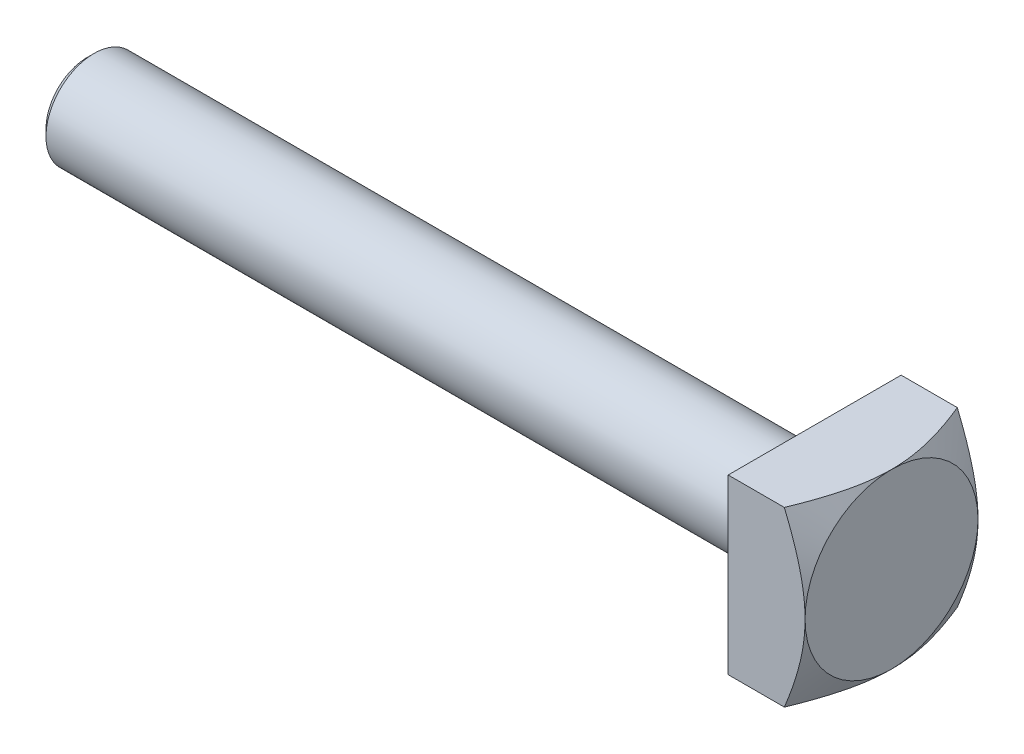
ISO-10303-21;
HEADER;
FILE_DESCRIPTION(('STEP AP214'),'2;1');
FILE_NAME('part.step','',(''),(''),'','','');
FILE_SCHEMA(('AUTOMOTIVE_DESIGN { 1 0 10303 214 1 1 1 1 }'));
ENDSEC;
DATA;
#1=APPLICATION_CONTEXT('core data for automotive mechanical design processes');
#2=APPLICATION_PROTOCOL_DEFINITION('international standard','automotive_design',2000,#1);
#3=PRODUCT_CONTEXT('',#1,'mechanical');
#4=PRODUCT('Part','Part','',(#3));
#5=PRODUCT_RELATED_PRODUCT_CATEGORY('part','',(#4));
#6=PRODUCT_DEFINITION_FORMATION('','',#4);
#7=PRODUCT_DEFINITION_CONTEXT('part definition',#1,'design');
#8=PRODUCT_DEFINITION('design','',#6,#7);
#9=PRODUCT_DEFINITION_SHAPE('','',#8);
#10=(LENGTH_UNIT() NAMED_UNIT(*) SI_UNIT(.MILLI.,.METRE.));
#11=(NAMED_UNIT(*) PLANE_ANGLE_UNIT() SI_UNIT($,.RADIAN.));
#12=(NAMED_UNIT(*) SI_UNIT($,.STERADIAN.) SOLID_ANGLE_UNIT());
#13=UNCERTAINTY_MEASURE_WITH_UNIT(LENGTH_MEASURE(1.E-05),#10,'distance_accuracy_value','');
#14=(GEOMETRIC_REPRESENTATION_CONTEXT(3) GLOBAL_UNCERTAINTY_ASSIGNED_CONTEXT((#13)) GLOBAL_UNIT_ASSIGNED_CONTEXT((#10,
#11,#12)) REPRESENTATION_CONTEXT('',''));
#15=CARTESIAN_POINT('',(0.,0.,0.));
#16=DIRECTION('',(0.,0.,1.));
#17=DIRECTION('',(1.,0.,0.));
#18=AXIS2_PLACEMENT_3D('',#15,#16,#17);
#19=CARTESIAN_POINT('',(49.3325100261348,9.,-9.));
#20=DIRECTION('',(0.,0.,1.));
#21=DIRECTION('',(0.,-1.,0.));
#22=AXIS2_PLACEMENT_3D('',#19,#20,#21);
#23=PLANE('',#22);
#24=CARTESIAN_POINT('',(42.8571264990048,-18.1017748932251,-9.));
#25=CARTESIAN_POINT('',(43.0848290014647,-17.6612589377098,-9.));
#26=CARTESIAN_POINT('',(43.3112860429918,-17.2200930246903,-9.));
#27=CARTESIAN_POINT('',(43.7610460759945,-16.3361243206803,-9.));
#28=CARTESIAN_POINT('',(43.9843488789998,-15.893321433856,-9.));
#29=CARTESIAN_POINT('',(44.4275990724742,-15.0048139056271,-9.));
#30=CARTESIAN_POINT('',(44.6475379613083,-14.5591050150091,-9.));
#31=CARTESIAN_POINT('',(45.0826038939738,-13.6653526957074,-9.));
#32=CARTESIAN_POINT('',(45.2977310422765,-13.2173093179705,-9.));
#33=CARTESIAN_POINT('',(45.7339460114688,-12.2929271397109,-9.));
#34=CARTESIAN_POINT('',(45.9546822234214,-11.8164219208137,-9.));
#35=CARTESIAN_POINT('',(46.3874426773042,-10.8594183684812,-9.));
#36=CARTESIAN_POINT('',(46.5994663826154,-10.3789197912727,-9.));
#37=CARTESIAN_POINT('',(47.0118693140859,-9.41339556488041,-9.));
#38=CARTESIAN_POINT('',(47.2122579538238,-8.92837395459212,-9.));
#39=CARTESIAN_POINT('',(47.5977586152819,-7.95230683121941,-9.));
#40=CARTESIAN_POINT('',(47.782872961797,-7.46126224796708,-9.));
#41=CARTESIAN_POINT('',(48.0440952998417,-6.72205623629925,-9.));
#42=CARTESIAN_POINT('',(48.1279877465829,-6.47664584233824,-9.));
#43=CARTESIAN_POINT('',(48.2899112549478,-5.98390233794157,-9.));
#44=CARTESIAN_POINT('',(48.3679423425386,-5.7365692360293,-9.));
#45=CARTESIAN_POINT('',(48.5919234373371,-4.99146980810668,-9.));
#46=CARTESIAN_POINT('',(48.7277667272913,-4.49058825682384,-9.));
#47=CARTESIAN_POINT('',(48.9615567599171,-3.49029425867013,-9.));
#48=CARTESIAN_POINT('',(49.0602031345005,-2.99105052515099,-9.));
#49=CARTESIAN_POINT('',(49.1761930199103,-2.23731632818205,-9.));
#50=CARTESIAN_POINT('',(49.2095268563288,-1.9852530110465,-9.));
#51=CARTESIAN_POINT('',(49.2646801673453,-1.47988072595095,-9.));
#52=CARTESIAN_POINT('',(49.2865008184612,-1.22657188794033,-9.));
#53=CARTESIAN_POINT('',(49.3215491863488,-0.661621376465719,-9.));
#54=CARTESIAN_POINT('',(49.3317045942102,-0.349782683998991,-9.));
#55=CARTESIAN_POINT('',(49.3332232252704,0.273946712163919,-9.));
#56=CARTESIAN_POINT('',(49.3245857611839,0.585837417345174,-9.));
#57=CARTESIAN_POINT('',(49.2889201862553,1.20861594829024,-9.));
#58=CARTESIAN_POINT('',(49.2618883258218,1.51950355659402,-9.));
#59=CARTESIAN_POINT('',(49.1906150441582,2.13928297825901,-9.));
#60=CARTESIAN_POINT('',(49.1463730476391,2.44817472455294,-9.));
#61=CARTESIAN_POINT('',(49.0409293862979,3.07199163964561,-9.));
#62=CARTESIAN_POINT('',(48.9792843562127,3.38684108287753,-9.));
#63=CARTESIAN_POINT('',(48.8417401677814,4.01338447228308,-9.));
#64=CARTESIAN_POINT('',(48.7658406400166,4.32507833645622,-9.));
#65=CARTESIAN_POINT('',(48.6018632193055,4.94539738591791,-9.));
#66=CARTESIAN_POINT('',(48.5137790599304,5.25402090404895,-9.));
#67=CARTESIAN_POINT('',(48.3740006498793,5.71459738376124,-9.));
#68=CARTESIAN_POINT('',(48.3261331737932,5.86772771850972,-9.));
#69=CARTESIAN_POINT('',(48.228060525201,6.17323857639417,-9.));
#70=CARTESIAN_POINT('',(48.1778553539461,6.32561909993144,-9.));
#71=CARTESIAN_POINT('',(48.0336207759508,6.75327955916404,-9.));
#72=CARTESIAN_POINT('',(47.9371522959459,7.02773820362801,-9.));
#73=CARTESIAN_POINT('',(47.7382764571364,7.5745024899511,-9.));
#74=CARTESIAN_POINT('',(47.635868739271,7.84680800050774,-9.));
#75=CARTESIAN_POINT('',(47.4259979322936,8.38952634357004,-9.));
#76=CARTESIAN_POINT('',(47.3185337697091,8.65993876005014,-9.));
#77=CARTESIAN_POINT('',(47.0993180334821,9.1990230644776,-9.));
#78=CARTESIAN_POINT('',(46.9875663470345,9.46769490641265,-9.));
#79=CARTESIAN_POINT('',(46.6466464450032,10.2718794378225,-9.));
#80=CARTESIAN_POINT('',(46.4120049359439,10.8050727688798,-9.));
#81=CARTESIAN_POINT('',(45.9320394137551,11.8665226777474,-9.));
#82=CARTESIAN_POINT('',(45.6867165417881,12.3947797756403,-9.));
#83=CARTESIAN_POINT('',(45.1872036037991,13.4491484430963,-9.));
#84=CARTESIAN_POINT('',(44.9329876443729,13.9752477145128,-9.));
#85=CARTESIAN_POINT('',(44.4183349749992,15.0244001691293,-9.));
#86=CARTESIAN_POINT('',(44.157898129916,15.5474532858505,-9.));
#87=CARTESIAN_POINT('',(43.6323200467052,16.5908336156542,-9.));
#88=CARTESIAN_POINT('',(43.3671814160637,17.1111621443734,-9.));
#89=CARTESIAN_POINT('',(42.8330653729605,18.149836976446,-9.));
#90=CARTESIAN_POINT('',(42.5640879911795,18.6681832956,-8.99999999999999));
#91=CARTESIAN_POINT('',(41.8255485481526,20.0811503383153,-8.99999999999999));
#92=CARTESIAN_POINT('',(41.3529251789218,20.9741702349986,-8.99999999999999));
#93=CARTESIAN_POINT('',(40.4011346006905,22.7568811836065,-8.99999999999999));
#94=CARTESIAN_POINT('',(39.9219664042756,23.6465717068492,-8.99999999999999));
#95=CARTESIAN_POINT('',(38.9620672069348,25.4174938178518,-8.99999999999999));
#96=CARTESIAN_POINT('',(38.4813675560373,26.2987424115097,-8.99999999999999));
#97=CARTESIAN_POINT('',(37.7577081518417,27.6190826148847,-8.99999999999999));
#98=CARTESIAN_POINT('',(37.5160745934232,28.0589021981923,-8.99999999999999));
#99=CARTESIAN_POINT('',(37.0320269665231,28.938110759695,-8.99999999999999));
#100=CARTESIAN_POINT('',(36.7896128993166,29.3774997385919,-8.99999999999999));
#101=CARTESIAN_POINT('',(36.5468597869242,29.8167013755112,-8.99999999999999));
#102=B_SPLINE_CURVE_WITH_KNOTS('',3,(#24,#25,#26,#27,#28,#29,#30,#31,#32,#33,#34,#35,#36,#37,
#38,#39,#40,#41,#42,#43,#44,#45,#46,#47,#48,#49,#50,#51,#52,#53,#54,#55,#56,#57,#58,#59,#60,#61,
#62,#63,#64,#65,#66,#67,#68,#69,#70,#71,#72,#73,#74,#75,#76,#77,#78,#79,#80,#81,#82,#83,#84,#85,
#86,#87,#88,#89,#90,#91,#92,#93,#94,#95,#96,#97,#98,#99,#100,#101),.UNSPECIFIED.,.F.,.F.,(4,2,2,
2,2,2,2,2,2,2,2,2,2,2,2,2,2,2,2,2,2,2,2,2,2,2,2,2,2,2,2,2,2,2,2,2,2,2,4),(0.,1.48766363582432,
2.97541578887709,4.46645434609266,5.95746049873591,7.53284221712307,9.10832082110335,
10.6825064628679,12.2564520650098,13.0344472240505,13.8124389361993,15.3683742473705,
16.8933806396812,17.6559266959657,18.418394813519,19.3538325720914,20.2893045416898,
21.2249672589862,22.1606612556801,23.1227603009219,24.0848842833078,25.0475049284993,
25.5288024194435,26.0100996527724,26.8827674953854,27.7554881508663,28.6283949265052,
29.5013246841486,31.2487573650983,32.9960038118538,34.7488487487578,36.5017317972244,
38.2536713934606,40.0055969953789,43.0366786505794,46.0682227686008,49.0796961462,
50.5851697239116,52.0906408435993),.UNSPECIFIED.);
#103=CARTESIAN_POINT('',(47.1801932204919,-9.,-9.));
#104=VERTEX_POINT('',#103);
#105=CARTESIAN_POINT('',(49.3325100261348,0.,-9.));
#106=VERTEX_POINT('',#105);
#107=EDGE_CURVE('E214',#104,#106,#102,.T.);
#108=ORIENTED_EDGE('',*,*,#107,.F.);
#109=DIRECTION('',(-1.,0.,0.));
#110=VECTOR('',#109,1.);
#111=CARTESIAN_POINT('',(49.3325100261348,-9.,-9.));
#112=LINE('',#111,#110);
#113=CARTESIAN_POINT('',(41.3325100261348,-9.,-9.));
#114=VERTEX_POINT('',#113);
#115=EDGE_CURVE('E203',#104,#114,#112,.T.);
#116=ORIENTED_EDGE('',*,*,#115,.T.);
#117=DIRECTION('',(0.,1.,0.));
#118=VECTOR('',#117,1.);
#119=CARTESIAN_POINT('',(41.3325100261348,9.,-9.));
#120=LINE('',#119,#118);
#121=CARTESIAN_POINT('',(41.3325100261348,9.,-9.));
#122=VERTEX_POINT('',#121);
#123=EDGE_CURVE('E212',#114,#122,#120,.T.);
#124=ORIENTED_EDGE('',*,*,#123,.T.);
#125=DIRECTION('',(-1.,0.,0.));
#126=VECTOR('',#125,1.);
#127=CARTESIAN_POINT('',(49.3325100261348,9.,-9.));
#128=LINE('',#127,#126);
#129=CARTESIAN_POINT('',(47.180193220492,9.,-8.99999999999999));
#130=VERTEX_POINT('',#129);
#131=EDGE_CURVE('E193',#130,#122,#128,.T.);
#132=ORIENTED_EDGE('',*,*,#131,.F.);
#133=EDGE_CURVE('E98',#106,#130,#102,.T.);
#134=ORIENTED_EDGE('',*,*,#133,.F.);
#135=EDGE_LOOP('',(#108,#116,#124,#132,#134));
#136=FACE_BOUND('',#135,.T.);
#137=ADVANCED_FACE('F42',(#136),#23,.F.);
#138=CARTESIAN_POINT('',(49.3325100261348,9.,9.));
#139=DIRECTION('',(0.,-1.,0.));
#140=DIRECTION('',(1.,0.,0.));
#141=AXIS2_PLACEMENT_3D('',#138,#139,#140);
#142=PLANE('',#141);
#143=CARTESIAN_POINT('',(42.8571265009112,9.,-18.1017748895375));
#144=CARTESIAN_POINT('',(43.0848290032961,9.,-17.6612589341495));
#145=CARTESIAN_POINT('',(43.3112860447483,9.,-17.2200930212575));
#146=CARTESIAN_POINT('',(43.7610460776014,9.,-16.3361243175025));
#147=CARTESIAN_POINT('',(43.984348880532,9.,-15.8933214308058));
#148=CARTESIAN_POINT('',(44.4275990738574,9.,-15.0048139028331));
#149=CARTESIAN_POINT('',(44.6475379626171,9.,-14.5591050123436));
#150=CARTESIAN_POINT('',(45.0826038951346,9.,-13.6653526932995));
#151=CARTESIAN_POINT('',(45.2977310433637,9.,-13.2173093156917));
#152=CARTESIAN_POINT('',(45.7339460124,9.,-12.292927137711));
#153=CARTESIAN_POINT('',(45.9546822242704,9.,-11.8164219189638));
#154=CARTESIAN_POINT('',(46.3874426779917,9.,-10.859418366933));
#155=CARTESIAN_POINT('',(46.5994663832237,9.,-10.378919789876));
#156=CARTESIAN_POINT('',(47.0118693145404,9.,-9.41339556378903));
#157=CARTESIAN_POINT('',(47.2122579542037,9.,-8.92837395365442));
#158=CARTESIAN_POINT('',(47.59775861552,9.,-7.95230683059232));
#159=CARTESIAN_POINT('',(47.7828729619681,9.,-7.46126224749691));
#160=CARTESIAN_POINT('',(48.0440952999135,9.,-6.72205623608937));
#161=CARTESIAN_POINT('',(48.1279877466184,9.,-6.47664584223019));
#162=CARTESIAN_POINT('',(48.2899112549158,9.,-5.98390233803879));
#163=CARTESIAN_POINT('',(48.3679423424753,9.,-5.73656923622994));
#164=CARTESIAN_POINT('',(48.5919234371887,9.,-4.99146980862027));
#165=CARTESIAN_POINT('',(48.7277667270982,9.,-4.49058825754963));
#166=CARTESIAN_POINT('',(48.9615567596714,9.,-3.49029425981931));
#167=CARTESIAN_POINT('',(49.0602031342458,9.,-2.99105052651115));
#168=CARTESIAN_POINT('',(49.1761930196747,9.,-2.23731632986047));
#169=CARTESIAN_POINT('',(49.209526856105,9.,-1.98525301283123));
#170=CARTESIAN_POINT('',(49.2646801671563,9.,-1.47988072794818));
#171=CARTESIAN_POINT('',(49.2865008182954,9.,-1.22657189004375));
#172=CARTESIAN_POINT('',(49.3215491862619,9.,-0.661621378563955));
#173=CARTESIAN_POINT('',(49.3317045941679,9.,-0.349782685984671));
#174=CARTESIAN_POINT('',(49.3332232253036,9.,0.273946710405681));
#175=CARTESIAN_POINT('',(49.324585761248,9.,0.585837415701822));
#176=CARTESIAN_POINT('',(49.2889201863663,9.,1.20861594687753));
#177=CARTESIAN_POINT('',(49.2618883259489,9.,1.51950355529706));
#178=CARTESIAN_POINT('',(49.1906150443029,9.,2.1392829771931));
#179=CARTESIAN_POINT('',(49.1463730477854,9.,2.44817472360233));
#180=CARTESIAN_POINT('',(49.0409293864338,9.,3.07199163892937));
#181=CARTESIAN_POINT('',(48.9792843563362,9.,3.38684108228029));
#182=CARTESIAN_POINT('',(48.8417401678683,9.,4.01338447192159));
#183=CARTESIAN_POINT('',(48.7658406400794,9.,4.32507833621148));
#184=CARTESIAN_POINT('',(48.6018632193108,9.,4.94539738590476));
#185=CARTESIAN_POINT('',(48.5137790599021,9.,5.25402090415064));
#186=CARTESIAN_POINT('',(48.3740006497954,9.,5.71459738403346));
#187=CARTESIAN_POINT('',(48.3261331736899,9.,5.86772771883849));
#188=CARTESIAN_POINT('',(48.2280605250571,9.,6.17323857683552));
#189=CARTESIAN_POINT('',(48.1778553537812,9.,6.32561910042881));
#190=CARTESIAN_POINT('',(48.0336207757631,9.,6.7532795597048));
#191=CARTESIAN_POINT('',(47.9371522957579,9.,7.02773820415654));
#192=CARTESIAN_POINT('',(47.7382764569487,9.,7.57450249045549));
#193=CARTESIAN_POINT('',(47.635868739084,9.,7.8468080010002));
#194=CARTESIAN_POINT('',(47.4259979321088,9.,8.38952634403891));
#195=CARTESIAN_POINT('',(47.3185337695259,9.,8.65993876050735));
#196=CARTESIAN_POINT('',(47.0993180333028,9.,9.19902306491171));
#197=CARTESIAN_POINT('',(46.9875663468575,9.,9.46769490683534));
#198=CARTESIAN_POINT('',(46.6466464448341,9.,10.2718794382111));
#199=CARTESIAN_POINT('',(46.4120049357812,9.,10.805072769246));
#200=CARTESIAN_POINT('',(45.9320394136067,9.,11.8665226780694));
#201=CARTESIAN_POINT('',(45.6867165416476,9.,12.3947797759406));
#202=CARTESIAN_POINT('',(45.187203603676,9.,13.4491484433524));
#203=CARTESIAN_POINT('',(44.9329876442593,9.,13.9752477147464));
#204=CARTESIAN_POINT('',(44.4183349749054,9.,15.0244001693183));
#205=CARTESIAN_POINT('',(44.1578981298326,9.,15.5474532860173));
#206=CARTESIAN_POINT('',(43.6323200466427,9.,16.5908336157771));
#207=CARTESIAN_POINT('',(43.3671814160119,9.,17.1111621444745));
#208=CARTESIAN_POINT('',(42.8330653729305,9.,18.1498369765037));
#209=CARTESIAN_POINT('',(42.5640879911607,9.,18.6681832956361));
#210=CARTESIAN_POINT('',(41.825548548165,9.,20.0811503382915));
#211=CARTESIAN_POINT('',(41.3529251789544,9.,20.9741702349368));
#212=CARTESIAN_POINT('',(40.4011346007645,9.,22.7568811834687));
#213=CARTESIAN_POINT('',(39.9219664043703,9.,23.6465717066735));
#214=CARTESIAN_POINT('',(38.9620672070701,9.,25.4174938176032));
#215=CARTESIAN_POINT('',(38.4813675561922,9.,26.298742411226));
#216=CARTESIAN_POINT('',(37.7577081520262,9.,27.6190826145486));
#217=CARTESIAN_POINT('',(37.5160745936175,9.,28.0589021978388));
#218=CARTESIAN_POINT('',(37.0320269667372,9.,28.9381107593066));
#219=CARTESIAN_POINT('',(36.7896128995406,9.,29.3774997381861));
#220=CARTESIAN_POINT('',(36.5468597871582,9.,29.8167013750879));
#221=B_SPLINE_CURVE_WITH_KNOTS('',3,(#143,#144,#145,#146,#147,#148,#149,#150,#151,#152,#153,
#154,#155,#156,#157,#158,#159,#160,#161,#162,#163,#164,#165,#166,#167,#168,#169,#170,#171,#172,
#173,#174,#175,#176,#177,#178,#179,#180,#181,#182,#183,#184,#185,#186,#187,#188,#189,#190,#191,
#192,#193,#194,#195,#196,#197,#198,#199,#200,#201,#202,#203,#204,#205,#206,#207,#208,#209,#210,
#211,#212,#213,#214,#215,#216,#217,#218,#219,#220),.UNSPECIFIED.,.F.,.F.,(4,2,2,2,2,2,2,2,2,2,2,
2,2,2,2,2,2,2,2,2,2,2,2,2,2,2,2,2,2,2,2,2,2,2,2,2,2,2,4),(0.,1.48766363538162,2.97541578799165,
4.46645434476266,5.95746049696137,7.53284221483657,9.10832081830478,10.6825064595578,
12.2564520611885,13.0344472199051,13.8124389317298,15.3683742422529,16.8933806339401,
17.6559266899135,18.4183948071557,19.3538325660694,20.2893045360091,21.2249672536466,
22.1606612506816,23.1227602962805,24.0848842790234,25.0475049245735,25.5288024156972,
26.0100996492054,26.8827674917841,27.7554881472308,28.6283949228355,29.5013246804446,
31.2487573613252,32.9960038080116,34.7488487448424,36.5017317932358,38.2536713893991,
40.0055969912446,43.0366786463155,46.0682227642071,49.0796961416859,50.5851697193374,
52.0906408389649),.UNSPECIFIED.);
#222=CARTESIAN_POINT('',(49.3325100261348,9.,0.));
#223=VERTEX_POINT('',#222);
#224=EDGE_CURVE('E94',#130,#223,#221,.T.);
#225=ORIENTED_EDGE('',*,*,#224,.F.);
#226=ORIENTED_EDGE('',*,*,#131,.T.);
#227=DIRECTION('',(0.,0.,1.));
#228=VECTOR('',#227,1.);
#229=CARTESIAN_POINT('',(41.3325100261348,9.,9.));
#230=LINE('',#229,#228);
#231=CARTESIAN_POINT('',(41.3325100261348,9.,9.));
#232=VERTEX_POINT('',#231);
#233=EDGE_CURVE('E211',#122,#232,#230,.T.);
#234=ORIENTED_EDGE('',*,*,#233,.T.);
#235=DIRECTION('',(-1.,0.,0.));
#236=VECTOR('',#235,1.);
#237=CARTESIAN_POINT('',(49.3325100261348,9.,9.));
#238=LINE('',#237,#236);
#239=CARTESIAN_POINT('',(47.1801932204919,9.,9.));
#240=VERTEX_POINT('',#239);
#241=EDGE_CURVE('E115',#240,#232,#238,.T.);
#242=ORIENTED_EDGE('',*,*,#241,.F.);
#243=EDGE_CURVE('E102',#223,#240,#221,.T.);
#244=ORIENTED_EDGE('',*,*,#243,.F.);
#245=EDGE_LOOP('',(#225,#226,#234,#242,#244));
#246=FACE_BOUND('',#245,.T.);
#247=ADVANCED_FACE('F113',(#246),#142,.F.);
#248=CARTESIAN_POINT('',(49.3325100261348,9.,9.));
#249=DIRECTION('',(0.,0.,-1.));
#250=DIRECTION('',(-1.,0.,0.));
#251=AXIS2_PLACEMENT_3D('',#248,#249,#250);
#252=PLANE('',#251);
#253=CARTESIAN_POINT('',(42.8571265009112,-18.1017748895375,9.));
#254=CARTESIAN_POINT('',(43.0848290032961,-17.6612589341495,9.));
#255=CARTESIAN_POINT('',(43.3112860447482,-17.2200930212575,9.));
#256=CARTESIAN_POINT('',(43.7610460776014,-16.3361243175025,9.));
#257=CARTESIAN_POINT('',(43.984348880532,-15.8933214308058,9.));
#258=CARTESIAN_POINT('',(44.4275990738574,-15.0048139028331,9.));
#259=CARTESIAN_POINT('',(44.6475379626171,-14.5591050123436,9.));
#260=CARTESIAN_POINT('',(45.0826038951346,-13.6653526932995,9.));
#261=CARTESIAN_POINT('',(45.2977310433637,-13.2173093156917,9.));
#262=CARTESIAN_POINT('',(45.7339460124,-12.292927137711,9.));
#263=CARTESIAN_POINT('',(45.9546822242704,-11.8164219189638,9.));
#264=CARTESIAN_POINT('',(46.3874426779917,-10.859418366933,9.));
#265=CARTESIAN_POINT('',(46.5994663832237,-10.378919789876,9.));
#266=CARTESIAN_POINT('',(47.0118693145404,-9.41339556378903,9.));
#267=CARTESIAN_POINT('',(47.2122579542037,-8.92837395365442,9.));
#268=CARTESIAN_POINT('',(47.59775861552,-7.95230683059232,9.));
#269=CARTESIAN_POINT('',(47.7828729619681,-7.46126224749691,9.));
#270=CARTESIAN_POINT('',(48.0440952999135,-6.72205623608937,9.));
#271=CARTESIAN_POINT('',(48.1279877466184,-6.47664584223019,9.));
#272=CARTESIAN_POINT('',(48.2899112549158,-5.98390233803879,9.));
#273=CARTESIAN_POINT('',(48.3679423424753,-5.73656923622994,9.));
#274=CARTESIAN_POINT('',(48.5919234371887,-4.99146980862027,9.));
#275=CARTESIAN_POINT('',(48.7277667270982,-4.49058825754963,9.));
#276=CARTESIAN_POINT('',(48.9615567596714,-3.49029425981931,9.));
#277=CARTESIAN_POINT('',(49.0602031342458,-2.99105052651115,9.));
#278=CARTESIAN_POINT('',(49.1761930196747,-2.23731632986048,9.));
#279=CARTESIAN_POINT('',(49.209526856105,-1.98525301283123,9.));
#280=CARTESIAN_POINT('',(49.2646801671563,-1.47988072794818,9.));
#281=CARTESIAN_POINT('',(49.2865008182954,-1.22657189004375,9.));
#282=CARTESIAN_POINT('',(49.3215491862619,-0.661621378563957,9.));
#283=CARTESIAN_POINT('',(49.3317045941679,-0.349782685984673,9.));
#284=CARTESIAN_POINT('',(49.3332232253036,0.27394671040568,9.));
#285=CARTESIAN_POINT('',(49.324585761248,0.585837415701821,9.));
#286=CARTESIAN_POINT('',(49.2889201863663,1.20861594687753,9.));
#287=CARTESIAN_POINT('',(49.2618883259489,1.51950355529706,9.));
#288=CARTESIAN_POINT('',(49.1906150443029,2.1392829771931,9.));
#289=CARTESIAN_POINT('',(49.1463730477854,2.44817472360233,9.));
#290=CARTESIAN_POINT('',(49.0409293864338,3.07199163892937,9.));
#291=CARTESIAN_POINT('',(48.9792843563362,3.38684108228029,9.));
#292=CARTESIAN_POINT('',(48.8417401678683,4.01338447192159,9.));
#293=CARTESIAN_POINT('',(48.7658406400794,4.32507833621148,9.));
#294=CARTESIAN_POINT('',(48.6018632193108,4.94539738590476,9.));
#295=CARTESIAN_POINT('',(48.5137790599021,5.25402090415063,9.));
#296=CARTESIAN_POINT('',(48.3740006497954,5.71459738403345,9.));
#297=CARTESIAN_POINT('',(48.3261331736899,5.86772771883849,9.));
#298=CARTESIAN_POINT('',(48.2280605250571,6.17323857683551,9.));
#299=CARTESIAN_POINT('',(48.1778553537812,6.32561910042881,9.));
#300=CARTESIAN_POINT('',(48.0336207757631,6.75327955970481,9.));
#301=CARTESIAN_POINT('',(47.9371522957579,7.02773820415655,9.));
#302=CARTESIAN_POINT('',(47.7382764569487,7.57450249045549,9.));
#303=CARTESIAN_POINT('',(47.6358687390839,7.8468080010002,9.));
#304=CARTESIAN_POINT('',(47.4259979321088,8.38952634403891,9.));
#305=CARTESIAN_POINT('',(47.3185337695259,8.65993876050735,9.));
#306=CARTESIAN_POINT('',(47.0993180333028,9.19902306491171,9.));
#307=CARTESIAN_POINT('',(46.9875663468575,9.46769490683534,9.));
#308=CARTESIAN_POINT('',(46.6466464448341,10.2718794382111,9.));
#309=CARTESIAN_POINT('',(46.4120049357812,10.805072769246,9.));
#310=CARTESIAN_POINT('',(45.9320394136067,11.8665226780694,9.));
#311=CARTESIAN_POINT('',(45.6867165416476,12.3947797759406,9.));
#312=CARTESIAN_POINT('',(45.187203603676,13.4491484433524,9.));
#313=CARTESIAN_POINT('',(44.9329876442593,13.9752477147464,9.));
#314=CARTESIAN_POINT('',(44.4183349749054,15.0244001693183,9.));
#315=CARTESIAN_POINT('',(44.1578981298326,15.5474532860173,9.));
#316=CARTESIAN_POINT('',(43.6323200466427,16.5908336157771,9.));
#317=CARTESIAN_POINT('',(43.3671814160119,17.1111621444745,9.));
#318=CARTESIAN_POINT('',(42.8330653729305,18.1498369765037,9.));
#319=CARTESIAN_POINT('',(42.5640879911607,18.6681832956361,9.));
#320=CARTESIAN_POINT('',(41.825548548165,20.0811503382915,9.));
#321=CARTESIAN_POINT('',(41.3529251789544,20.9741702349368,9.));
#322=CARTESIAN_POINT('',(40.4011346007645,22.7568811834687,9.));
#323=CARTESIAN_POINT('',(39.9219664043703,23.6465717066735,9.));
#324=CARTESIAN_POINT('',(38.9620672070701,25.4174938176032,9.));
#325=CARTESIAN_POINT('',(38.4813675561922,26.298742411226,9.));
#326=CARTESIAN_POINT('',(37.7577081520262,27.6190826145486,9.));
#327=CARTESIAN_POINT('',(37.5160745936175,28.0589021978388,9.));
#328=CARTESIAN_POINT('',(37.0320269667372,28.9381107593066,9.));
#329=CARTESIAN_POINT('',(36.7896128995406,29.3774997381861,9.));
#330=CARTESIAN_POINT('',(36.5468597871582,29.8167013750879,9.));
#331=B_SPLINE_CURVE_WITH_KNOTS('',3,(#253,#254,#255,#256,#257,#258,#259,#260,#261,#262,#263,
#264,#265,#266,#267,#268,#269,#270,#271,#272,#273,#274,#275,#276,#277,#278,#279,#280,#281,#282,
#283,#284,#285,#286,#287,#288,#289,#290,#291,#292,#293,#294,#295,#296,#297,#298,#299,#300,#301,
#302,#303,#304,#305,#306,#307,#308,#309,#310,#311,#312,#313,#314,#315,#316,#317,#318,#319,#320,
#321,#322,#323,#324,#325,#326,#327,#328,#329,#330),.UNSPECIFIED.,.F.,.F.,(4,2,2,2,2,2,2,2,2,2,2,
2,2,2,2,2,2,2,2,2,2,2,2,2,2,2,2,2,2,2,2,2,2,2,2,2,2,2,4),(0.,1.48766363538162,2.97541578799166,
4.46645434476267,5.95746049696138,7.53284221483658,9.1083208183048,10.6825064595579,
12.2564520611885,13.0344472199051,13.8124389317298,15.3683742422529,16.8933806339401,
17.6559266899135,18.4183948071557,19.3538325660694,20.2893045360091,21.2249672536466,
22.1606612506817,23.1227602962805,24.0848842790234,25.0475049245735,25.5288024156972,
26.0100996492054,26.8827674917842,27.7554881472309,28.6283949228355,29.5013246804446,
31.2487573613252,32.9960038080116,34.7488487448424,36.5017317932358,38.2536713893992,
40.0055969912446,43.0366786463155,46.0682227642071,49.079696141686,50.5851697193374,
52.0906408389649),.UNSPECIFIED.);
#332=CARTESIAN_POINT('',(49.3325100261348,0.,9.));
#333=VERTEX_POINT('',#332);
#334=EDGE_CURVE('E107',#240,#333,#331,.F.);
#335=ORIENTED_EDGE('',*,*,#334,.F.);
#336=ORIENTED_EDGE('',*,*,#241,.T.);
#337=DIRECTION('',(0.,-1.,0.));
#338=VECTOR('',#337,1.);
#339=CARTESIAN_POINT('',(41.3325100261348,9.,9.));
#340=LINE('',#339,#338);
#341=CARTESIAN_POINT('',(41.3325100261348,-9.,9.));
#342=VERTEX_POINT('',#341);
#343=EDGE_CURVE('E208',#232,#342,#340,.T.);
#344=ORIENTED_EDGE('',*,*,#343,.T.);
#345=DIRECTION('',(-1.,0.,0.));
#346=VECTOR('',#345,1.);
#347=CARTESIAN_POINT('',(49.3325100261348,-9.,9.));
#348=LINE('',#347,#346);
#349=CARTESIAN_POINT('',(47.1801932204919,-9.,9.));
#350=VERTEX_POINT('',#349);
#351=EDGE_CURVE('E201',#350,#342,#348,.T.);
#352=ORIENTED_EDGE('',*,*,#351,.F.);
#353=EDGE_CURVE('E116',#333,#350,#331,.F.);
#354=ORIENTED_EDGE('',*,*,#353,.F.);
#355=EDGE_LOOP('',(#335,#336,#344,#352,#354));
#356=FACE_BOUND('',#355,.T.);
#357=ADVANCED_FACE('F158',(#356),#252,.F.);
#358=CARTESIAN_POINT('',(49.3325100261348,-9.,9.));
#359=DIRECTION('',(0.,1.,0.));
#360=DIRECTION('',(-1.,0.,0.));
#361=AXIS2_PLACEMENT_3D('',#358,#359,#360);
#362=PLANE('',#361);
#363=CARTESIAN_POINT('',(42.8571264990048,-9.,-18.1017748932251));
#364=CARTESIAN_POINT('',(43.0848290014647,-9.,-17.6612589377098));
#365=CARTESIAN_POINT('',(43.3112860429918,-9.,-17.2200930246903));
#366=CARTESIAN_POINT('',(43.7610460759945,-9.,-16.3361243206803));
#367=CARTESIAN_POINT('',(43.9843488789998,-9.,-15.893321433856));
#368=CARTESIAN_POINT('',(44.4275990724742,-9.,-15.0048139056271));
#369=CARTESIAN_POINT('',(44.6475379613083,-9.,-14.5591050150091));
#370=CARTESIAN_POINT('',(45.0826038939738,-9.,-13.6653526957074));
#371=CARTESIAN_POINT('',(45.2977310422765,-9.,-13.2173093179705));
#372=CARTESIAN_POINT('',(45.7339460114688,-9.,-12.2929271397109));
#373=CARTESIAN_POINT('',(45.9546822234214,-9.,-11.8164219208137));
#374=CARTESIAN_POINT('',(46.3874426773042,-9.,-10.8594183684812));
#375=CARTESIAN_POINT('',(46.5994663826154,-9.,-10.3789197912727));
#376=CARTESIAN_POINT('',(47.0118693140859,-9.,-9.41339556488041));
#377=CARTESIAN_POINT('',(47.2122579538238,-9.,-8.92837395459212));
#378=CARTESIAN_POINT('',(47.5977586152819,-9.,-7.95230683121941));
#379=CARTESIAN_POINT('',(47.782872961797,-9.,-7.46126224796707));
#380=CARTESIAN_POINT('',(48.0440952998417,-9.,-6.72205623629925));
#381=CARTESIAN_POINT('',(48.1279877465829,-9.,-6.47664584233823));
#382=CARTESIAN_POINT('',(48.2899112549478,-9.,-5.98390233794157));
#383=CARTESIAN_POINT('',(48.3679423425386,-9.,-5.73656923602929));
#384=CARTESIAN_POINT('',(48.5919234373371,-9.,-4.99146980810668));
#385=CARTESIAN_POINT('',(48.7277667272913,-9.,-4.49058825682383));
#386=CARTESIAN_POINT('',(48.9615567599171,-9.,-3.49029425867012));
#387=CARTESIAN_POINT('',(49.0602031345005,-9.,-2.99105052515099));
#388=CARTESIAN_POINT('',(49.1761930199103,-9.,-2.23731632818204));
#389=CARTESIAN_POINT('',(49.2095268563288,-9.,-1.98525301104649));
#390=CARTESIAN_POINT('',(49.2646801673453,-9.,-1.47988072595095));
#391=CARTESIAN_POINT('',(49.2865008184612,-9.,-1.22657188794033));
#392=CARTESIAN_POINT('',(49.3215491863488,-9.,-0.661621376465717));
#393=CARTESIAN_POINT('',(49.3317045942102,-9.,-0.349782683998989));
#394=CARTESIAN_POINT('',(49.3332232252704,-9.,0.273946712163919));
#395=CARTESIAN_POINT('',(49.3245857611839,-9.,0.585837417345174));
#396=CARTESIAN_POINT('',(49.2889201862553,-9.,1.20861594829024));
#397=CARTESIAN_POINT('',(49.2618883258218,-9.,1.51950355659402));
#398=CARTESIAN_POINT('',(49.1906150441582,-9.,2.139282978259));
#399=CARTESIAN_POINT('',(49.1463730476391,-9.,2.44817472455293));
#400=CARTESIAN_POINT('',(49.0409293862979,-9.,3.07199163964561));
#401=CARTESIAN_POINT('',(48.9792843562127,-9.,3.38684108287753));
#402=CARTESIAN_POINT('',(48.8417401677813,-9.,4.01338447228307));
#403=CARTESIAN_POINT('',(48.7658406400166,-9.,4.32507833645622));
#404=CARTESIAN_POINT('',(48.6018632193055,-9.,4.94539738591791));
#405=CARTESIAN_POINT('',(48.5137790599304,-9.,5.25402090404894));
#406=CARTESIAN_POINT('',(48.3740006498793,-9.,5.71459738376124));
#407=CARTESIAN_POINT('',(48.3261331737932,-9.,5.86772771850972));
#408=CARTESIAN_POINT('',(48.228060525201,-9.,6.17323857639417));
#409=CARTESIAN_POINT('',(48.177855353946,-9.,6.32561909993144));
#410=CARTESIAN_POINT('',(48.0336207759508,-9.,6.75327955916404));
#411=CARTESIAN_POINT('',(47.9371522959459,-9.,7.02773820362801));
#412=CARTESIAN_POINT('',(47.7382764571364,-9.,7.5745024899511));
#413=CARTESIAN_POINT('',(47.635868739271,-9.,7.84680800050774));
#414=CARTESIAN_POINT('',(47.4259979322936,-9.,8.38952634357004));
#415=CARTESIAN_POINT('',(47.3185337697091,-9.,8.65993876005015));
#416=CARTESIAN_POINT('',(47.0993180334821,-9.,9.1990230644776));
#417=CARTESIAN_POINT('',(46.9875663470345,-9.,9.46769490641265));
#418=CARTESIAN_POINT('',(46.6466464450032,-9.,10.2718794378225));
#419=CARTESIAN_POINT('',(46.4120049359439,-9.,10.8050727688798));
#420=CARTESIAN_POINT('',(45.9320394137551,-9.,11.8665226777474));
#421=CARTESIAN_POINT('',(45.6867165417881,-9.,12.3947797756403));
#422=CARTESIAN_POINT('',(45.1872036037991,-9.,13.4491484430963));
#423=CARTESIAN_POINT('',(44.9329876443729,-9.,13.9752477145128));
#424=CARTESIAN_POINT('',(44.4183349749992,-9.,15.0244001691294));
#425=CARTESIAN_POINT('',(44.157898129916,-9.,15.5474532858505));
#426=CARTESIAN_POINT('',(43.6323200467052,-9.,16.5908336156543));
#427=CARTESIAN_POINT('',(43.3671814160637,-9.,17.1111621443734));
#428=CARTESIAN_POINT('',(42.8330653729604,-9.,18.149836976446));
#429=CARTESIAN_POINT('',(42.5640879911795,-9.,18.6681832956));
#430=CARTESIAN_POINT('',(41.8255485481526,-9.,20.0811503383153));
#431=CARTESIAN_POINT('',(41.3529251789217,-9.,20.9741702349986));
#432=CARTESIAN_POINT('',(40.4011346006905,-9.,22.7568811836065));
#433=CARTESIAN_POINT('',(39.9219664042755,-9.,23.6465717068493));
#434=CARTESIAN_POINT('',(38.9620672069348,-9.,25.4174938178519));
#435=CARTESIAN_POINT('',(38.4813675560373,-9.,26.2987424115097));
#436=CARTESIAN_POINT('',(37.7577081518417,-9.,27.6190826148847));
#437=CARTESIAN_POINT('',(37.5160745934231,-9.,28.0589021981924));
#438=CARTESIAN_POINT('',(37.0320269665231,-9.,28.938110759695));
#439=CARTESIAN_POINT('',(36.7896128993166,-9.,29.3774997385919));
#440=CARTESIAN_POINT('',(36.5468597869242,-9.,29.8167013755112));
#441=B_SPLINE_CURVE_WITH_KNOTS('',3,(#363,#364,#365,#366,#367,#368,#369,#370,#371,#372,#373,
#374,#375,#376,#377,#378,#379,#380,#381,#382,#383,#384,#385,#386,#387,#388,#389,#390,#391,#392,
#393,#394,#395,#396,#397,#398,#399,#400,#401,#402,#403,#404,#405,#406,#407,#408,#409,#410,#411,
#412,#413,#414,#415,#416,#417,#418,#419,#420,#421,#422,#423,#424,#425,#426,#427,#428,#429,#430,
#431,#432,#433,#434,#435,#436,#437,#438,#439,#440),.UNSPECIFIED.,.F.,.F.,(4,2,2,2,2,2,2,2,2,2,2,
2,2,2,2,2,2,2,2,2,2,2,2,2,2,2,2,2,2,2,2,2,2,2,2,2,2,2,4),(0.,1.48766363582433,2.97541578887709,
4.46645434609265,5.9574604987359,7.53284221712307,9.10832082110335,10.6825064628679,
12.2564520650098,13.0344472240505,13.8124389361993,15.3683742473705,16.8933806396812,
17.6559266959657,18.418394813519,19.3538325720914,20.2893045416898,21.2249672589862,
22.1606612556801,23.1227603009219,24.0848842833078,25.0475049284993,25.5288024194435,
26.0100996527724,26.8827674953854,27.7554881508663,28.6283949265052,29.5013246841486,
31.2487573650983,32.9960038118538,34.7488487487578,36.5017317972244,38.2536713934606,
40.0055969953789,43.0366786505794,46.0682227686008,49.0796961462,50.5851697239116,
52.0906408435993),.UNSPECIFIED.);
#442=CARTESIAN_POINT('',(49.3325100261348,-9.,0.));
#443=VERTEX_POINT('',#442);
#444=EDGE_CURVE('E154',#350,#443,#441,.F.);
#445=ORIENTED_EDGE('',*,*,#444,.F.);
#446=ORIENTED_EDGE('',*,*,#351,.T.);
#447=DIRECTION('',(0.,0.,-1.));
#448=VECTOR('',#447,1.);
#449=CARTESIAN_POINT('',(41.3325100261348,-9.,9.));
#450=LINE('',#449,#448);
#451=EDGE_CURVE('E205',#342,#114,#450,.T.);
#452=ORIENTED_EDGE('',*,*,#451,.T.);
#453=ORIENTED_EDGE('',*,*,#115,.F.);
#454=EDGE_CURVE('E110',#443,#104,#441,.F.);
#455=ORIENTED_EDGE('',*,*,#454,.F.);
#456=EDGE_LOOP('',(#445,#446,#452,#453,#455));
#457=FACE_BOUND('',#456,.T.);
#458=ADVANCED_FACE('F155',(#457),#362,.F.);
#459=CARTESIAN_POINT('',(-34.3745967550517,4.29289321881344,0.));
#460=DIRECTION('',(1.,0.,0.));
#461=DIRECTION('',(0.,1.,0.));
#462=AXIS2_PLACEMENT_3D('',#459,#460,#461);
#463=PLANE('',#462);
#464=CARTESIAN_POINT('',(-34.3745967550517,0.,0.));
#465=DIRECTION('',(-1.,0.,0.));
#466=DIRECTION('',(0.,-1.,0.));
#467=AXIS2_PLACEMENT_3D('',#464,#465,#466);
#468=CIRCLE('',#467,4.29289321881344);
#469=CARTESIAN_POINT('',(-34.3745967550517,-4.29289321881344,0.));
#470=VERTEX_POINT('',#469);
#471=EDGE_CURVE('E192',#470,#470,#468,.T.);
#472=ORIENTED_EDGE('',*,*,#471,.T.);
#473=EDGE_LOOP('',(#472));
#474=FACE_BOUND('',#473,.T.);
#475=ADVANCED_FACE('F44',(#474),#463,.F.);
#476=CARTESIAN_POINT('',(-59.9733513767945,0.,0.));
#477=DIRECTION('',(-1.,0.,0.));
#478=DIRECTION('',(0.,-1.,0.));
#479=AXIS2_PLACEMENT_3D('',#476,#477,#478);
#480=CYLINDRICAL_SURFACE('',#479,5.);
#481=CARTESIAN_POINT('',(-33.6674899738652,0.,0.));
#482=DIRECTION('',(-1.,0.,0.));
#483=DIRECTION('',(0.,-1.,0.));
#484=AXIS2_PLACEMENT_3D('',#481,#482,#483);
#485=CIRCLE('',#484,5.);
#486=CARTESIAN_POINT('',(-33.6674899738652,-5.,0.));
#487=VERTEX_POINT('',#486);
#488=EDGE_CURVE('E187',#487,#487,#485,.T.);
#489=ORIENTED_EDGE('',*,*,#488,.F.);
#490=EDGE_LOOP('',(#489));
#491=FACE_BOUND('',#490,.T.);
#492=CARTESIAN_POINT('',(41.3325100261348,0.,0.));
#493=DIRECTION('',(1.,0.,0.));
#494=DIRECTION('',(0.,0.,-1.));
#495=AXIS2_PLACEMENT_3D('',#492,#493,#494);
#496=CIRCLE('',#495,5.);
#497=CARTESIAN_POINT('',(41.3325100261348,0.,-5.));
#498=VERTEX_POINT('',#497);
#499=EDGE_CURVE('E190',#498,#498,#496,.T.);
#500=ORIENTED_EDGE('',*,*,#499,.F.);
#501=EDGE_LOOP('',(#500));
#502=FACE_BOUND('',#501,.T.);
#503=ADVANCED_FACE('F176',(#491,#502),#480,.T.);
#504=CARTESIAN_POINT('',(-33.6674899738652,0.,0.));
#505=DIRECTION('',(1.,0.,0.));
#506=DIRECTION('',(0.,1.,0.));
#507=AXIS2_PLACEMENT_3D('',#504,#505,#506);
#508=CONICAL_SURFACE('',#507,5.,0.785398163397462);
#509=ORIENTED_EDGE('',*,*,#471,.F.);
#510=EDGE_LOOP('',(#509));
#511=FACE_BOUND('',#510,.T.);
#512=ORIENTED_EDGE('',*,*,#488,.T.);
#513=EDGE_LOOP('',(#512));
#514=FACE_BOUND('',#513,.T.);
#515=ADVANCED_FACE('F174',(#511,#514),#508,.T.);
#516=CARTESIAN_POINT('',(41.3325100261348,0.,0.));
#517=DIRECTION('',(1.,0.,0.));
#518=DIRECTION('',(0.,0.,-1.));
#519=AXIS2_PLACEMENT_3D('',#516,#517,#518);
#520=PLANE('',#519);
#521=ORIENTED_EDGE('',*,*,#123,.F.);
#522=ORIENTED_EDGE('',*,*,#451,.F.);
#523=ORIENTED_EDGE('',*,*,#343,.F.);
#524=ORIENTED_EDGE('',*,*,#233,.F.);
#525=EDGE_LOOP('',(#521,#522,#523,#524));
#526=FACE_BOUND('',#525,.T.);
#527=ORIENTED_EDGE('',*,*,#499,.T.);
#528=EDGE_LOOP('',(#527));
#529=FACE_BOUND('',#528,.T.);
#530=ADVANCED_FACE('F143',(#526,#529),#520,.F.);
#531=CARTESIAN_POINT('',(49.3325100261348,0.,0.));
#532=DIRECTION('',(-1.,0.,0.));
#533=DIRECTION('',(0.,0.,-1.));
#534=AXIS2_PLACEMENT_3D('',#531,#532,#533);
#535=CONICAL_SURFACE('',#534,9.,1.0471975511966);
#536=ORIENTED_EDGE('',*,*,#107,.T.);
#537=CARTESIAN_POINT('',(49.3325100261348,0.,0.));
#538=DIRECTION('',(1.,0.,0.));
#539=DIRECTION('',(0.,0.,-1.));
#540=AXIS2_PLACEMENT_3D('',#537,#538,#539);
#541=CIRCLE('',#540,9.);
#542=EDGE_CURVE('E46',#443,#106,#541,.T.);
#543=ORIENTED_EDGE('',*,*,#542,.F.);
#544=ORIENTED_EDGE('',*,*,#454,.T.);
#545=EDGE_LOOP('',(#536,#543,#544));
#546=FACE_BOUND('',#545,.T.);
#547=ADVANCED_FACE('F138',(#546),#535,.T.);
#548=ORIENTED_EDGE('',*,*,#353,.T.);
#549=ORIENTED_EDGE('',*,*,#444,.T.);
#550=EDGE_CURVE('E51',#333,#443,#541,.T.);
#551=ORIENTED_EDGE('',*,*,#550,.F.);
#552=EDGE_LOOP('',(#548,#549,#551));
#553=FACE_BOUND('',#552,.T.);
#554=ADVANCED_FACE('F142',(#553),#535,.T.);
#555=ORIENTED_EDGE('',*,*,#243,.T.);
#556=ORIENTED_EDGE('',*,*,#334,.T.);
#557=EDGE_CURVE('E12',#223,#333,#541,.T.);
#558=ORIENTED_EDGE('',*,*,#557,.F.);
#559=EDGE_LOOP('',(#555,#556,#558));
#560=FACE_BOUND('',#559,.T.);
#561=ADVANCED_FACE('F105',(#560),#535,.T.);
#562=ORIENTED_EDGE('',*,*,#133,.T.);
#563=ORIENTED_EDGE('',*,*,#224,.T.);
#564=CARTESIAN_POINT('',(49.3325100261348,0.,0.));
#565=DIRECTION('',(1.,0.,0.));
#566=DIRECTION('',(0.,0.,-1.));
#567=AXIS2_PLACEMENT_3D('',#564,#565,#566);
#568=CIRCLE('',#567,9.);
#569=EDGE_CURVE('E58',#106,#223,#568,.T.);
#570=ORIENTED_EDGE('',*,*,#569,.F.);
#571=EDGE_LOOP('',(#562,#563,#570));
#572=FACE_BOUND('',#571,.T.);
#573=ADVANCED_FACE('F96',(#572),#535,.T.);
#574=CARTESIAN_POINT('',(49.3325100261348,0.,0.));
#575=DIRECTION('',(1.,0.,0.));
#576=DIRECTION('',(0.,0.,-1.));
#577=AXIS2_PLACEMENT_3D('',#574,#575,#576);
#578=PLANE('',#577);
#579=ORIENTED_EDGE('',*,*,#542,.T.);
#580=ORIENTED_EDGE('',*,*,#569,.T.);
#581=ORIENTED_EDGE('',*,*,#557,.T.);
#582=ORIENTED_EDGE('',*,*,#550,.T.);
#583=EDGE_LOOP('',(#579,#580,#581,#582));
#584=FACE_BOUND('',#583,.T.);
#585=ADVANCED_FACE('F109',(#584),#578,.T.);
#586=CLOSED_SHELL('',(#137,#247,#357,#458,#475,#503,#515,#530,#547,#554,#561,#573,#585));
#587=MANIFOLD_SOLID_BREP('B2',#586);
#588=ADVANCED_BREP_SHAPE_REPRESENTATION('',(#18,#587),#14);
#589=SHAPE_DEFINITION_REPRESENTATION(#9,#588);
ENDSEC;
END-ISO-10303-21;
